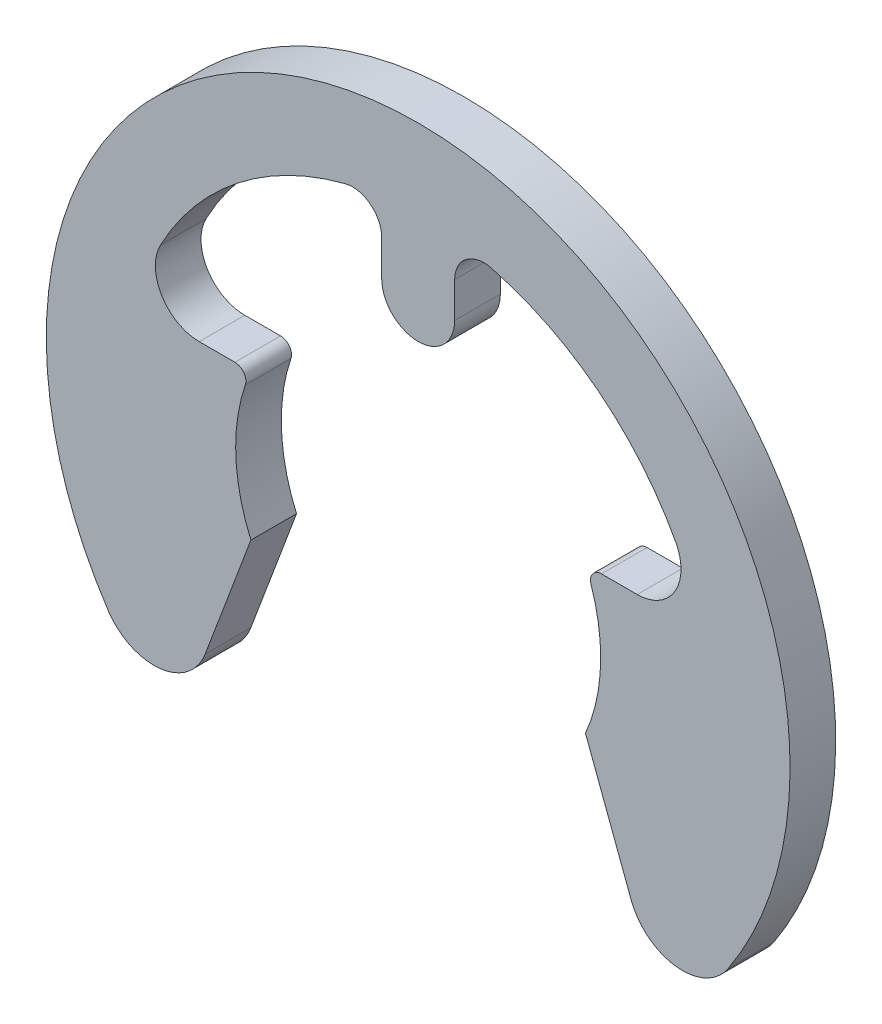
ISO-10303-21;
HEADER;
FILE_DESCRIPTION(('STEP AP214'),'2;1');
FILE_NAME('part.step','',(''),(''),'','','');
FILE_SCHEMA(('AUTOMOTIVE_DESIGN { 1 0 10303 214 1 1 1 1 }'));
ENDSEC;
DATA;
#1=APPLICATION_CONTEXT('core data for automotive mechanical design processes');
#2=APPLICATION_PROTOCOL_DEFINITION('international standard','automotive_design',2000,#1);
#3=PRODUCT_CONTEXT('',#1,'mechanical');
#4=PRODUCT('Part','Part','',(#3));
#5=PRODUCT_RELATED_PRODUCT_CATEGORY('part','',(#4));
#6=PRODUCT_DEFINITION_FORMATION('','',#4);
#7=PRODUCT_DEFINITION_CONTEXT('part definition',#1,'design');
#8=PRODUCT_DEFINITION('design','',#6,#7);
#9=PRODUCT_DEFINITION_SHAPE('','',#8);
#10=(LENGTH_UNIT() NAMED_UNIT(*) SI_UNIT(.MILLI.,.METRE.));
#11=(NAMED_UNIT(*) PLANE_ANGLE_UNIT() SI_UNIT($,.RADIAN.));
#12=(NAMED_UNIT(*) SI_UNIT($,.STERADIAN.) SOLID_ANGLE_UNIT());
#13=UNCERTAINTY_MEASURE_WITH_UNIT(LENGTH_MEASURE(1.E-05),#10,'distance_accuracy_value','');
#14=(GEOMETRIC_REPRESENTATION_CONTEXT(3) GLOBAL_UNCERTAINTY_ASSIGNED_CONTEXT((#13)) GLOBAL_UNIT_ASSIGNED_CONTEXT((#10,
#11,#12)) REPRESENTATION_CONTEXT('',''));
#15=CARTESIAN_POINT('',(0.,0.,0.));
#16=DIRECTION('',(0.,0.,1.));
#17=DIRECTION('',(1.,0.,0.));
#18=AXIS2_PLACEMENT_3D('',#15,#16,#17);
#19=CARTESIAN_POINT('',(0.,-2.35501053749592,0.));
#20=DIRECTION('',(0.,0.,1.));
#21=DIRECTION('',(1.,0.,0.));
#22=AXIS2_PLACEMENT_3D('',#19,#20,#21);
#23=PLANE('',#22);
#24=CARTESIAN_POINT('',(5.79124126513042,-8.31875027863897,0.));
#25=DIRECTION('',(0.,0.,1.));
#26=DIRECTION('',(1.,0.,0.));
#27=AXIS2_PLACEMENT_3D('',#24,#25,#26);
#28=CIRCLE('',#27,1.2);
#29=CARTESIAN_POINT('',(4.66801826128774,-8.74108910427382,0.));
#30=VERTEX_POINT('',#29);
#31=CARTESIAN_POINT('',(6.79116781450546,-8.98218595438676,0.));
#32=VERTEX_POINT('',#31);
#33=EDGE_CURVE('E155',#30,#32,#28,.T.);
#34=ORIENTED_EDGE('',*,*,#33,.F.);
#35=DIRECTION('',(0.351949021362376,-0.936019169868901,0.));
#36=VECTOR('',#35,1.);
#37=CARTESIAN_POINT('',(4.66801826128775,-8.74108910427382,0.));
#38=LINE('',#37,#36);
#39=CARTESIAN_POINT('',(3.66606055596467,-6.076351989933,0.));
#40=VERTEX_POINT('',#39);
#41=EDGE_CURVE('E170',#40,#30,#38,.T.);
#42=ORIENTED_EDGE('',*,*,#41,.F.);
#43=CARTESIAN_POINT('',(0.,-4.476351989933,0.));
#44=DIRECTION('',(0.,0.,1.));
#45=DIRECTION('',(1.,0.,0.));
#46=AXIS2_PLACEMENT_3D('',#43,#44,#45);
#47=CIRCLE('',#46,4.);
#48=CARTESIAN_POINT('',(3.78864917675808,-3.19333312200847,0.));
#49=VERTEX_POINT('',#48);
#50=EDGE_CURVE('E175',#40,#49,#47,.T.);
#51=ORIENTED_EDGE('',*,*,#50,.T.);
#52=CARTESIAN_POINT('',(4.01596812736356,-3.116351989933,0.));
#53=DIRECTION('',(0.,0.,1.));
#54=DIRECTION('',(1.,0.,0.));
#55=AXIS2_PLACEMENT_3D('',#52,#53,#54);
#56=CIRCLE('',#55,0.24);
#57=CARTESIAN_POINT('',(4.01596812736356,-2.876351989933,0.));
#58=VERTEX_POINT('',#57);
#59=EDGE_CURVE('E178',#58,#49,#56,.T.);
#60=ORIENTED_EDGE('',*,*,#59,.F.);
#61=DIRECTION('',(1.,0.,0.));
#62=VECTOR('',#61,1.);
#63=CARTESIAN_POINT('',(4.01596812736356,-2.876351989933,0.));
#64=LINE('',#63,#62);
#65=CARTESIAN_POINT('',(4.8,-2.876351989933,0.));
#66=VERTEX_POINT('',#65);
#67=EDGE_CURVE('E223',#66,#58,#64,.F.);
#68=ORIENTED_EDGE('',*,*,#67,.F.);
#69=CARTESIAN_POINT('',(4.8,-1.916351989933,0.));
#70=DIRECTION('',(0.,0.,1.));
#71=DIRECTION('',(1.,0.,0.));
#72=AXIS2_PLACEMENT_3D('',#69,#70,#71);
#73=CIRCLE('',#72,0.96);
#74=CARTESIAN_POINT('',(5.64705882352941,-1.46458728405065,0.));
#75=VERTEX_POINT('',#74);
#76=EDGE_CURVE('E182',#66,#75,#73,.T.);
#77=ORIENTED_EDGE('',*,*,#76,.T.);
#78=CARTESIAN_POINT('',(0.,-4.476351989933,0.));
#79=DIRECTION('',(0.,0.,1.));
#80=DIRECTION('',(1.,0.,0.));
#81=AXIS2_PLACEMENT_3D('',#78,#79,#80);
#82=CIRCLE('',#81,6.4);
#83=CARTESIAN_POINT('',(1.6,1.72042136399887,0.));
#84=VERTEX_POINT('',#83);
#85=EDGE_CURVE('E186',#75,#84,#82,.T.);
#86=ORIENTED_EDGE('',*,*,#85,.T.);
#87=CARTESIAN_POINT('',(1.44,1.10074402860568,0.));
#88=DIRECTION('',(0.,0.,1.));
#89=DIRECTION('',(1.,0.,0.));
#90=AXIS2_PLACEMENT_3D('',#87,#88,#89);
#91=CIRCLE('',#90,0.64);
#92=CARTESIAN_POINT('',(0.8,1.10074402860568,0.));
#93=VERTEX_POINT('',#92);
#94=EDGE_CURVE('E189',#84,#93,#91,.T.);
#95=ORIENTED_EDGE('',*,*,#94,.T.);
#96=DIRECTION('',(0.,1.,0.));
#97=VECTOR('',#96,1.);
#98=CARTESIAN_POINT('',(0.8,1.10074402860568,0.));
#99=LINE('',#98,#97);
#100=CARTESIAN_POINT('',(0.8,0.323648010067,0.));
#101=VERTEX_POINT('',#100);
#102=EDGE_CURVE('E191',#101,#93,#99,.T.);
#103=ORIENTED_EDGE('',*,*,#102,.F.);
#104=CARTESIAN_POINT('',(0.,0.323648010067,0.));
#105=DIRECTION('',(0.,0.,1.));
#106=DIRECTION('',(1.,0.,0.));
#107=AXIS2_PLACEMENT_3D('',#104,#105,#106);
#108=CIRCLE('',#107,0.8);
#109=CARTESIAN_POINT('',(-0.8,0.323648010067,0.));
#110=VERTEX_POINT('',#109);
#111=EDGE_CURVE('E192',#110,#101,#108,.T.);
#112=ORIENTED_EDGE('',*,*,#111,.F.);
#113=DIRECTION('',(0.,1.,0.));
#114=VECTOR('',#113,1.);
#115=CARTESIAN_POINT('',(-0.8,0.323648010066999,0.));
#116=LINE('',#115,#114);
#117=CARTESIAN_POINT('',(-0.8,1.10074402860568,0.));
#118=VERTEX_POINT('',#117);
#119=EDGE_CURVE('E228',#118,#110,#116,.F.);
#120=ORIENTED_EDGE('',*,*,#119,.F.);
#121=CARTESIAN_POINT('',(-1.44,1.10074402860568,0.));
#122=DIRECTION('',(0.,0.,1.));
#123=DIRECTION('',(1.,0.,0.));
#124=AXIS2_PLACEMENT_3D('',#121,#122,#123);
#125=CIRCLE('',#124,0.64);
#126=CARTESIAN_POINT('',(-1.6,1.72042136399887,0.));
#127=VERTEX_POINT('',#126);
#128=EDGE_CURVE('E196',#118,#127,#125,.T.);
#129=ORIENTED_EDGE('',*,*,#128,.T.);
#130=CARTESIAN_POINT('',(0.,-4.476351989933,0.));
#131=DIRECTION('',(0.,0.,1.));
#132=DIRECTION('',(1.,0.,0.));
#133=AXIS2_PLACEMENT_3D('',#130,#131,#132);
#134=CIRCLE('',#133,6.4);
#135=CARTESIAN_POINT('',(-5.64705882352941,-1.46458728405065,0.));
#136=VERTEX_POINT('',#135);
#137=EDGE_CURVE('E200',#127,#136,#134,.T.);
#138=ORIENTED_EDGE('',*,*,#137,.T.);
#139=CARTESIAN_POINT('',(-4.8,-1.916351989933,0.));
#140=DIRECTION('',(0.,0.,1.));
#141=DIRECTION('',(1.,0.,0.));
#142=AXIS2_PLACEMENT_3D('',#139,#140,#141);
#143=CIRCLE('',#142,0.96);
#144=CARTESIAN_POINT('',(-4.8,-2.876351989933,0.));
#145=VERTEX_POINT('',#144);
#146=EDGE_CURVE('E203',#136,#145,#143,.T.);
#147=ORIENTED_EDGE('',*,*,#146,.T.);
#148=DIRECTION('',(1.,0.,0.));
#149=VECTOR('',#148,1.);
#150=CARTESIAN_POINT('',(-4.8,-2.876351989933,0.));
#151=LINE('',#150,#149);
#152=CARTESIAN_POINT('',(-4.01596812736356,-2.876351989933,0.));
#153=VERTEX_POINT('',#152);
#154=EDGE_CURVE('E205',#153,#145,#151,.F.);
#155=ORIENTED_EDGE('',*,*,#154,.F.);
#156=CARTESIAN_POINT('',(-4.01596812736356,-3.116351989933,0.));
#157=DIRECTION('',(0.,0.,1.));
#158=DIRECTION('',(1.,0.,0.));
#159=AXIS2_PLACEMENT_3D('',#156,#157,#158);
#160=CIRCLE('',#159,0.24);
#161=CARTESIAN_POINT('',(-3.78864917675808,-3.19333312200847,0.));
#162=VERTEX_POINT('',#161);
#163=EDGE_CURVE('E206',#162,#153,#160,.T.);
#164=ORIENTED_EDGE('',*,*,#163,.F.);
#165=CARTESIAN_POINT('',(0.,-4.476351989933,0.));
#166=DIRECTION('',(0.,0.,1.));
#167=DIRECTION('',(1.,0.,0.));
#168=AXIS2_PLACEMENT_3D('',#165,#166,#167);
#169=CIRCLE('',#168,4.);
#170=CARTESIAN_POINT('',(-3.66606055596467,-6.076351989933,0.));
#171=VERTEX_POINT('',#170);
#172=EDGE_CURVE('E210',#162,#171,#169,.T.);
#173=ORIENTED_EDGE('',*,*,#172,.T.);
#174=DIRECTION('',(0.351949021362376,0.936019169868901,0.));
#175=VECTOR('',#174,1.);
#176=CARTESIAN_POINT('',(-3.66606055596467,-6.076351989933,0.));
#177=LINE('',#176,#175);
#178=CARTESIAN_POINT('',(-4.66801826128775,-8.74108910427382,0.));
#179=VERTEX_POINT('',#178);
#180=EDGE_CURVE('E212',#179,#171,#177,.T.);
#181=ORIENTED_EDGE('',*,*,#180,.F.);
#182=CARTESIAN_POINT('',(-5.79124126513042,-8.31875027863897,0.));
#183=DIRECTION('',(0.,0.,1.));
#184=DIRECTION('',(1.,0.,0.));
#185=AXIS2_PLACEMENT_3D('',#182,#183,#184);
#186=CIRCLE('',#185,1.2);
#187=CARTESIAN_POINT('',(-6.79116781450546,-8.98218595438676,0.));
#188=VERTEX_POINT('',#187);
#189=EDGE_CURVE('E157',#188,#179,#186,.T.);
#190=ORIENTED_EDGE('',*,*,#189,.F.);
#191=CARTESIAN_POINT('',(0.,-4.476351989933,0.));
#192=DIRECTION('',(0.,0.,1.));
#193=DIRECTION('',(1.,0.,0.));
#194=AXIS2_PLACEMENT_3D('',#191,#192,#193);
#195=CIRCLE('',#194,8.15);
#196=EDGE_CURVE('E20',#32,#188,#195,.T.);
#197=ORIENTED_EDGE('',*,*,#196,.F.);
#198=EDGE_LOOP('',(#34,#42,#51,#60,#68,#77,#86,#95,#103,#112,#120,#129,#138,#147,#155,#164,#173,
#181,#190,#197));
#199=FACE_BOUND('',#198,.T.);
#200=ADVANCED_FACE('F17',(#199),#23,.F.);
#201=CARTESIAN_POINT('',(0.,-4.476351989933,0.));
#202=DIRECTION('',(0.,0.,1.));
#203=DIRECTION('',(1.,0.,0.));
#204=AXIS2_PLACEMENT_3D('',#201,#202,#203);
#205=CYLINDRICAL_SURFACE('',#204,8.15);
#206=ORIENTED_EDGE('',*,*,#196,.T.);
#207=DIRECTION('',(0.,0.,1.));
#208=VECTOR('',#207,1.);
#209=CARTESIAN_POINT('',(-6.79116781450546,-8.98218595438676,0.));
#210=LINE('',#209,#208);
#211=CARTESIAN_POINT('',(-6.79116781450546,-8.98218595438676,1.));
#212=VERTEX_POINT('',#211);
#213=EDGE_CURVE('E160',#212,#188,#210,.F.);
#214=ORIENTED_EDGE('',*,*,#213,.F.);
#215=CARTESIAN_POINT('',(0.,-4.476351989933,1.));
#216=DIRECTION('',(0.,0.,1.));
#217=DIRECTION('',(1.,0.,0.));
#218=AXIS2_PLACEMENT_3D('',#215,#216,#217);
#219=CIRCLE('',#218,8.15);
#220=CARTESIAN_POINT('',(6.79116781450546,-8.98218595438676,1.));
#221=VERTEX_POINT('',#220);
#222=EDGE_CURVE('E165',#221,#212,#219,.T.);
#223=ORIENTED_EDGE('',*,*,#222,.F.);
#224=DIRECTION('',(0.,0.,1.));
#225=VECTOR('',#224,1.);
#226=CARTESIAN_POINT('',(6.79116781450546,-8.98218595438676,0.));
#227=LINE('',#226,#225);
#228=EDGE_CURVE('E162',#32,#221,#227,.T.);
#229=ORIENTED_EDGE('',*,*,#228,.F.);
#230=EDGE_LOOP('',(#206,#214,#223,#229));
#231=FACE_BOUND('',#230,.T.);
#232=ADVANCED_FACE('F163',(#231),#205,.T.);
#233=CARTESIAN_POINT('',(-5.79124126513042,-8.31875027863897,0.));
#234=DIRECTION('',(0.,0.,1.));
#235=DIRECTION('',(1.,0.,0.));
#236=AXIS2_PLACEMENT_3D('',#233,#234,#235);
#237=CYLINDRICAL_SURFACE('',#236,1.2);
#238=ORIENTED_EDGE('',*,*,#189,.T.);
#239=DIRECTION('',(0.,0.,1.));
#240=VECTOR('',#239,1.);
#241=CARTESIAN_POINT('',(-4.66801826128775,-8.74108910427382,0.));
#242=LINE('',#241,#240);
#243=CARTESIAN_POINT('',(-4.66801826128775,-8.74108910427382,1.));
#244=VERTEX_POINT('',#243);
#245=EDGE_CURVE('E213',#244,#179,#242,.F.);
#246=ORIENTED_EDGE('',*,*,#245,.F.);
#247=CARTESIAN_POINT('',(-5.79124126513042,-8.31875027863897,1.));
#248=DIRECTION('',(0.,0.,1.));
#249=DIRECTION('',(1.,0.,0.));
#250=AXIS2_PLACEMENT_3D('',#247,#248,#249);
#251=CIRCLE('',#250,1.2);
#252=EDGE_CURVE('E272',#212,#244,#251,.T.);
#253=ORIENTED_EDGE('',*,*,#252,.F.);
#254=ORIENTED_EDGE('',*,*,#213,.T.);
#255=EDGE_LOOP('',(#238,#246,#253,#254));
#256=FACE_BOUND('',#255,.T.);
#257=ADVANCED_FACE('F379',(#256),#237,.T.);
#258=CARTESIAN_POINT('',(-3.66606055596467,-6.076351989933,0.));
#259=DIRECTION('',(0.936019169868901,-0.351949021362376,0.));
#260=DIRECTION('',(0.351949021362376,0.936019169868901,0.));
#261=AXIS2_PLACEMENT_3D('',#258,#259,#260);
#262=PLANE('',#261);
#263=ORIENTED_EDGE('',*,*,#180,.T.);
#264=DIRECTION('',(0.,0.,1.));
#265=VECTOR('',#264,1.);
#266=CARTESIAN_POINT('',(-3.66606055596467,-6.076351989933,0.));
#267=LINE('',#266,#265);
#268=CARTESIAN_POINT('',(-3.66606055596467,-6.076351989933,1.));
#269=VERTEX_POINT('',#268);
#270=EDGE_CURVE('E211',#171,#269,#267,.T.);
#271=ORIENTED_EDGE('',*,*,#270,.T.);
#272=DIRECTION('',(0.351949021362376,0.9360191698689,0.));
#273=VECTOR('',#272,1.);
#274=CARTESIAN_POINT('',(-4.66801826128775,-8.74108910427382,1.));
#275=LINE('',#274,#273);
#276=EDGE_CURVE('E271',#244,#269,#275,.T.);
#277=ORIENTED_EDGE('',*,*,#276,.F.);
#278=ORIENTED_EDGE('',*,*,#245,.T.);
#279=EDGE_LOOP('',(#263,#271,#277,#278));
#280=FACE_BOUND('',#279,.T.);
#281=ADVANCED_FACE('F316',(#280),#262,.T.);
#282=CARTESIAN_POINT('',(0.,-4.476351989933,0.));
#283=DIRECTION('',(0.,0.,1.));
#284=DIRECTION('',(1.,0.,0.));
#285=AXIS2_PLACEMENT_3D('',#282,#283,#284);
#286=CYLINDRICAL_SURFACE('',#285,4.);
#287=ORIENTED_EDGE('',*,*,#270,.F.);
#288=ORIENTED_EDGE('',*,*,#172,.F.);
#289=DIRECTION('',(0.,0.,1.));
#290=VECTOR('',#289,1.);
#291=CARTESIAN_POINT('',(-3.78864917675808,-3.19333312200847,0.));
#292=LINE('',#291,#290);
#293=CARTESIAN_POINT('',(-3.78864917675808,-3.19333312200847,1.));
#294=VERTEX_POINT('',#293);
#295=EDGE_CURVE('E209',#294,#162,#292,.F.);
#296=ORIENTED_EDGE('',*,*,#295,.F.);
#297=CARTESIAN_POINT('',(0.,-4.476351989933,1.));
#298=DIRECTION('',(0.,0.,1.));
#299=DIRECTION('',(1.,0.,0.));
#300=AXIS2_PLACEMENT_3D('',#297,#298,#299);
#301=CIRCLE('',#300,4.);
#302=EDGE_CURVE('E269',#269,#294,#301,.F.);
#303=ORIENTED_EDGE('',*,*,#302,.F.);
#304=EDGE_LOOP('',(#287,#288,#296,#303));
#305=FACE_BOUND('',#304,.T.);
#306=ADVANCED_FACE('F318',(#305),#286,.F.);
#307=CARTESIAN_POINT('',(-4.01596812736356,-3.116351989933,0.));
#308=DIRECTION('',(0.,0.,1.));
#309=DIRECTION('',(1.,0.,0.));
#310=AXIS2_PLACEMENT_3D('',#307,#308,#309);
#311=CYLINDRICAL_SURFACE('',#310,0.24);
#312=ORIENTED_EDGE('',*,*,#163,.T.);
#313=DIRECTION('',(0.,0.,1.));
#314=VECTOR('',#313,1.);
#315=CARTESIAN_POINT('',(-4.01596812736356,-2.876351989933,0.));
#316=LINE('',#315,#314);
#317=CARTESIAN_POINT('',(-4.01596812736356,-2.876351989933,1.));
#318=VERTEX_POINT('',#317);
#319=EDGE_CURVE('E208',#318,#153,#316,.F.);
#320=ORIENTED_EDGE('',*,*,#319,.F.);
#321=CARTESIAN_POINT('',(-4.01596812736356,-3.116351989933,1.));
#322=DIRECTION('',(0.,0.,1.));
#323=DIRECTION('',(1.,0.,0.));
#324=AXIS2_PLACEMENT_3D('',#321,#322,#323);
#325=CIRCLE('',#324,0.24);
#326=EDGE_CURVE('E266',#294,#318,#325,.T.);
#327=ORIENTED_EDGE('',*,*,#326,.F.);
#328=ORIENTED_EDGE('',*,*,#295,.T.);
#329=EDGE_LOOP('',(#312,#320,#327,#328));
#330=FACE_BOUND('',#329,.T.);
#331=ADVANCED_FACE('F322',(#330),#311,.T.);
#332=CARTESIAN_POINT('',(-4.8,-2.876351989933,0.));
#333=DIRECTION('',(0.,1.,0.));
#334=DIRECTION('',(0.,0.,1.));
#335=AXIS2_PLACEMENT_3D('',#332,#333,#334);
#336=PLANE('',#335);
#337=ORIENTED_EDGE('',*,*,#154,.T.);
#338=DIRECTION('',(0.,0.,1.));
#339=VECTOR('',#338,1.);
#340=CARTESIAN_POINT('',(-4.8,-2.876351989933,0.));
#341=LINE('',#340,#339);
#342=CARTESIAN_POINT('',(-4.8,-2.876351989933,1.));
#343=VERTEX_POINT('',#342);
#344=EDGE_CURVE('E202',#145,#343,#341,.T.);
#345=ORIENTED_EDGE('',*,*,#344,.T.);
#346=DIRECTION('',(1.,0.,0.));
#347=VECTOR('',#346,1.);
#348=CARTESIAN_POINT('',(0.,-2.876351989933,1.));
#349=LINE('',#348,#347);
#350=EDGE_CURVE('E265',#318,#343,#349,.F.);
#351=ORIENTED_EDGE('',*,*,#350,.F.);
#352=ORIENTED_EDGE('',*,*,#319,.T.);
#353=EDGE_LOOP('',(#337,#345,#351,#352));
#354=FACE_BOUND('',#353,.T.);
#355=ADVANCED_FACE('F326',(#354),#336,.T.);
#356=CARTESIAN_POINT('',(-4.8,-1.916351989933,0.));
#357=DIRECTION('',(0.,0.,1.));
#358=DIRECTION('',(1.,0.,0.));
#359=AXIS2_PLACEMENT_3D('',#356,#357,#358);
#360=CYLINDRICAL_SURFACE('',#359,0.96);
#361=ORIENTED_EDGE('',*,*,#344,.F.);
#362=ORIENTED_EDGE('',*,*,#146,.F.);
#363=DIRECTION('',(0.,0.,1.));
#364=VECTOR('',#363,1.);
#365=CARTESIAN_POINT('',(-5.64705882352941,-1.46458728405065,0.));
#366=LINE('',#365,#364);
#367=CARTESIAN_POINT('',(-5.64705882352941,-1.46458728405065,1.));
#368=VERTEX_POINT('',#367);
#369=EDGE_CURVE('E199',#136,#368,#366,.T.);
#370=ORIENTED_EDGE('',*,*,#369,.T.);
#371=CARTESIAN_POINT('',(-4.8,-1.916351989933,1.));
#372=DIRECTION('',(0.,0.,1.));
#373=DIRECTION('',(1.,0.,0.));
#374=AXIS2_PLACEMENT_3D('',#371,#372,#373);
#375=CIRCLE('',#374,0.96);
#376=EDGE_CURVE('E262',#343,#368,#375,.F.);
#377=ORIENTED_EDGE('',*,*,#376,.F.);
#378=EDGE_LOOP('',(#361,#362,#370,#377));
#379=FACE_BOUND('',#378,.T.);
#380=ADVANCED_FACE('F331',(#379),#360,.F.);
#381=CARTESIAN_POINT('',(0.,-4.476351989933,0.));
#382=DIRECTION('',(0.,0.,1.));
#383=DIRECTION('',(1.,0.,0.));
#384=AXIS2_PLACEMENT_3D('',#381,#382,#383);
#385=CYLINDRICAL_SURFACE('',#384,6.4);
#386=ORIENTED_EDGE('',*,*,#369,.F.);
#387=ORIENTED_EDGE('',*,*,#137,.F.);
#388=DIRECTION('',(0.,0.,1.));
#389=VECTOR('',#388,1.);
#390=CARTESIAN_POINT('',(-1.6,1.72042136399887,0.));
#391=LINE('',#390,#389);
#392=CARTESIAN_POINT('',(-1.6,1.72042136399887,1.));
#393=VERTEX_POINT('',#392);
#394=EDGE_CURVE('E198',#127,#393,#391,.T.);
#395=ORIENTED_EDGE('',*,*,#394,.T.);
#396=CARTESIAN_POINT('',(0.,-4.476351989933,1.));
#397=DIRECTION('',(0.,0.,1.));
#398=DIRECTION('',(1.,0.,0.));
#399=AXIS2_PLACEMENT_3D('',#396,#397,#398);
#400=CIRCLE('',#399,6.4);
#401=EDGE_CURVE('E259',#368,#393,#400,.F.);
#402=ORIENTED_EDGE('',*,*,#401,.F.);
#403=EDGE_LOOP('',(#386,#387,#395,#402));
#404=FACE_BOUND('',#403,.T.);
#405=ADVANCED_FACE('F336',(#404),#385,.F.);
#406=CARTESIAN_POINT('',(-1.44,1.10074402860568,0.));
#407=DIRECTION('',(0.,0.,1.));
#408=DIRECTION('',(1.,0.,0.));
#409=AXIS2_PLACEMENT_3D('',#406,#407,#408);
#410=CYLINDRICAL_SURFACE('',#409,0.64);
#411=ORIENTED_EDGE('',*,*,#394,.F.);
#412=ORIENTED_EDGE('',*,*,#128,.F.);
#413=DIRECTION('',(0.,0.,1.));
#414=VECTOR('',#413,1.);
#415=CARTESIAN_POINT('',(-0.8,1.10074402860568,0.));
#416=LINE('',#415,#414);
#417=CARTESIAN_POINT('',(-0.8,1.10074402860568,1.));
#418=VERTEX_POINT('',#417);
#419=EDGE_CURVE('E230',#418,#118,#416,.F.);
#420=ORIENTED_EDGE('',*,*,#419,.F.);
#421=CARTESIAN_POINT('',(-1.44,1.10074402860568,1.));
#422=DIRECTION('',(0.,0.,1.));
#423=DIRECTION('',(1.,0.,0.));
#424=AXIS2_PLACEMENT_3D('',#421,#422,#423);
#425=CIRCLE('',#424,0.64);
#426=EDGE_CURVE('E256',#393,#418,#425,.F.);
#427=ORIENTED_EDGE('',*,*,#426,.F.);
#428=EDGE_LOOP('',(#411,#412,#420,#427));
#429=FACE_BOUND('',#428,.T.);
#430=ADVANCED_FACE('F340',(#429),#410,.F.);
#431=CARTESIAN_POINT('',(-0.8,0.323648010066999,0.));
#432=DIRECTION('',(-1.,0.,0.));
#433=DIRECTION('',(0.,0.,1.));
#434=AXIS2_PLACEMENT_3D('',#431,#432,#433);
#435=PLANE('',#434);
#436=ORIENTED_EDGE('',*,*,#119,.T.);
#437=DIRECTION('',(0.,0.,1.));
#438=VECTOR('',#437,1.);
#439=CARTESIAN_POINT('',(-0.8,0.323648010066999,0.));
#440=LINE('',#439,#438);
#441=CARTESIAN_POINT('',(-0.8,0.323648010067,1.));
#442=VERTEX_POINT('',#441);
#443=EDGE_CURVE('E195',#442,#110,#440,.F.);
#444=ORIENTED_EDGE('',*,*,#443,.F.);
#445=DIRECTION('',(0.,1.,0.));
#446=VECTOR('',#445,1.);
#447=CARTESIAN_POINT('',(-0.8,-2.35501053749592,1.));
#448=LINE('',#447,#446);
#449=EDGE_CURVE('E255',#418,#442,#448,.F.);
#450=ORIENTED_EDGE('',*,*,#449,.F.);
#451=ORIENTED_EDGE('',*,*,#419,.T.);
#452=EDGE_LOOP('',(#436,#444,#450,#451));
#453=FACE_BOUND('',#452,.T.);
#454=ADVANCED_FACE('F344',(#453),#435,.T.);
#455=CARTESIAN_POINT('',(0.,0.323648010067,0.));
#456=DIRECTION('',(0.,0.,1.));
#457=DIRECTION('',(1.,0.,0.));
#458=AXIS2_PLACEMENT_3D('',#455,#456,#457);
#459=CYLINDRICAL_SURFACE('',#458,0.8);
#460=ORIENTED_EDGE('',*,*,#111,.T.);
#461=DIRECTION('',(0.,0.,-1.));
#462=VECTOR('',#461,1.);
#463=CARTESIAN_POINT('',(0.8,0.323648010066999,0.));
#464=LINE('',#463,#462);
#465=CARTESIAN_POINT('',(0.8,0.323648010067,1.));
#466=VERTEX_POINT('',#465);
#467=EDGE_CURVE('E194',#466,#101,#464,.T.);
#468=ORIENTED_EDGE('',*,*,#467,.F.);
#469=CARTESIAN_POINT('',(0.,0.323648010067,1.));
#470=DIRECTION('',(0.,0.,1.));
#471=DIRECTION('',(1.,0.,0.));
#472=AXIS2_PLACEMENT_3D('',#469,#470,#471);
#473=CIRCLE('',#472,0.8);
#474=EDGE_CURVE('E252',#442,#466,#473,.T.);
#475=ORIENTED_EDGE('',*,*,#474,.F.);
#476=ORIENTED_EDGE('',*,*,#443,.T.);
#477=EDGE_LOOP('',(#460,#468,#475,#476));
#478=FACE_BOUND('',#477,.T.);
#479=ADVANCED_FACE('F348',(#478),#459,.T.);
#480=CARTESIAN_POINT('',(0.8,1.10074402860568,0.));
#481=DIRECTION('',(1.,0.,0.));
#482=DIRECTION('',(0.,0.,-1.));
#483=AXIS2_PLACEMENT_3D('',#480,#481,#482);
#484=PLANE('',#483);
#485=ORIENTED_EDGE('',*,*,#102,.T.);
#486=DIRECTION('',(0.,0.,1.));
#487=VECTOR('',#486,1.);
#488=CARTESIAN_POINT('',(0.8,1.10074402860568,0.));
#489=LINE('',#488,#487);
#490=CARTESIAN_POINT('',(0.8,1.10074402860568,1.));
#491=VERTEX_POINT('',#490);
#492=EDGE_CURVE('E188',#93,#491,#489,.T.);
#493=ORIENTED_EDGE('',*,*,#492,.T.);
#494=DIRECTION('',(0.,1.,0.));
#495=VECTOR('',#494,1.);
#496=CARTESIAN_POINT('',(0.8,-2.35501053749592,1.));
#497=LINE('',#496,#495);
#498=EDGE_CURVE('E251',#466,#491,#497,.T.);
#499=ORIENTED_EDGE('',*,*,#498,.F.);
#500=ORIENTED_EDGE('',*,*,#467,.T.);
#501=EDGE_LOOP('',(#485,#493,#499,#500));
#502=FACE_BOUND('',#501,.T.);
#503=ADVANCED_FACE('F352',(#502),#484,.T.);
#504=CARTESIAN_POINT('',(1.44,1.10074402860568,0.));
#505=DIRECTION('',(0.,0.,1.));
#506=DIRECTION('',(1.,0.,0.));
#507=AXIS2_PLACEMENT_3D('',#504,#505,#506);
#508=CYLINDRICAL_SURFACE('',#507,0.64);
#509=ORIENTED_EDGE('',*,*,#492,.F.);
#510=ORIENTED_EDGE('',*,*,#94,.F.);
#511=DIRECTION('',(0.,0.,1.));
#512=VECTOR('',#511,1.);
#513=CARTESIAN_POINT('',(1.6,1.72042136399887,0.));
#514=LINE('',#513,#512);
#515=CARTESIAN_POINT('',(1.6,1.72042136399887,1.));
#516=VERTEX_POINT('',#515);
#517=EDGE_CURVE('E185',#84,#516,#514,.T.);
#518=ORIENTED_EDGE('',*,*,#517,.T.);
#519=CARTESIAN_POINT('',(1.44,1.10074402860568,1.));
#520=DIRECTION('',(0.,0.,1.));
#521=DIRECTION('',(1.,0.,0.));
#522=AXIS2_PLACEMENT_3D('',#519,#520,#521);
#523=CIRCLE('',#522,0.64);
#524=EDGE_CURVE('E248',#491,#516,#523,.F.);
#525=ORIENTED_EDGE('',*,*,#524,.F.);
#526=EDGE_LOOP('',(#509,#510,#518,#525));
#527=FACE_BOUND('',#526,.T.);
#528=ADVANCED_FACE('F357',(#527),#508,.F.);
#529=CARTESIAN_POINT('',(0.,-4.476351989933,0.));
#530=DIRECTION('',(0.,0.,1.));
#531=DIRECTION('',(1.,0.,0.));
#532=AXIS2_PLACEMENT_3D('',#529,#530,#531);
#533=CYLINDRICAL_SURFACE('',#532,6.4);
#534=ORIENTED_EDGE('',*,*,#517,.F.);
#535=ORIENTED_EDGE('',*,*,#85,.F.);
#536=DIRECTION('',(0.,0.,1.));
#537=VECTOR('',#536,1.);
#538=CARTESIAN_POINT('',(5.64705882352941,-1.46458728405065,0.));
#539=LINE('',#538,#537);
#540=CARTESIAN_POINT('',(5.64705882352941,-1.46458728405065,1.));
#541=VERTEX_POINT('',#540);
#542=EDGE_CURVE('E184',#75,#541,#539,.T.);
#543=ORIENTED_EDGE('',*,*,#542,.T.);
#544=CARTESIAN_POINT('',(0.,-4.476351989933,1.));
#545=DIRECTION('',(0.,0.,1.));
#546=DIRECTION('',(1.,0.,0.));
#547=AXIS2_PLACEMENT_3D('',#544,#545,#546);
#548=CIRCLE('',#547,6.4);
#549=EDGE_CURVE('E245',#516,#541,#548,.F.);
#550=ORIENTED_EDGE('',*,*,#549,.F.);
#551=EDGE_LOOP('',(#534,#535,#543,#550));
#552=FACE_BOUND('',#551,.T.);
#553=ADVANCED_FACE('F362',(#552),#533,.F.);
#554=CARTESIAN_POINT('',(4.8,-1.916351989933,0.));
#555=DIRECTION('',(0.,0.,1.));
#556=DIRECTION('',(1.,0.,0.));
#557=AXIS2_PLACEMENT_3D('',#554,#555,#556);
#558=CYLINDRICAL_SURFACE('',#557,0.96);
#559=ORIENTED_EDGE('',*,*,#542,.F.);
#560=ORIENTED_EDGE('',*,*,#76,.F.);
#561=DIRECTION('',(0.,0.,1.));
#562=VECTOR('',#561,1.);
#563=CARTESIAN_POINT('',(4.8,-2.876351989933,0.));
#564=LINE('',#563,#562);
#565=CARTESIAN_POINT('',(4.8,-2.876351989933,1.));
#566=VERTEX_POINT('',#565);
#567=EDGE_CURVE('E225',#566,#66,#564,.F.);
#568=ORIENTED_EDGE('',*,*,#567,.F.);
#569=CARTESIAN_POINT('',(4.8,-1.916351989933,1.));
#570=DIRECTION('',(0.,0.,1.));
#571=DIRECTION('',(1.,0.,0.));
#572=AXIS2_PLACEMENT_3D('',#569,#570,#571);
#573=CIRCLE('',#572,0.96);
#574=EDGE_CURVE('E242',#541,#566,#573,.F.);
#575=ORIENTED_EDGE('',*,*,#574,.F.);
#576=EDGE_LOOP('',(#559,#560,#568,#575));
#577=FACE_BOUND('',#576,.T.);
#578=ADVANCED_FACE('F366',(#577),#558,.F.);
#579=CARTESIAN_POINT('',(4.01596812736356,-2.876351989933,0.));
#580=DIRECTION('',(0.,1.,0.));
#581=DIRECTION('',(0.,0.,1.));
#582=AXIS2_PLACEMENT_3D('',#579,#580,#581);
#583=PLANE('',#582);
#584=ORIENTED_EDGE('',*,*,#67,.T.);
#585=DIRECTION('',(0.,0.,1.));
#586=VECTOR('',#585,1.);
#587=CARTESIAN_POINT('',(4.01596812736356,-2.876351989933,0.));
#588=LINE('',#587,#586);
#589=CARTESIAN_POINT('',(4.01596812736356,-2.876351989933,1.));
#590=VERTEX_POINT('',#589);
#591=EDGE_CURVE('E181',#590,#58,#588,.F.);
#592=ORIENTED_EDGE('',*,*,#591,.F.);
#593=DIRECTION('',(1.,0.,0.));
#594=VECTOR('',#593,1.);
#595=CARTESIAN_POINT('',(0.,-2.876351989933,1.));
#596=LINE('',#595,#594);
#597=EDGE_CURVE('E241',#566,#590,#596,.F.);
#598=ORIENTED_EDGE('',*,*,#597,.F.);
#599=ORIENTED_EDGE('',*,*,#567,.T.);
#600=EDGE_LOOP('',(#584,#592,#598,#599));
#601=FACE_BOUND('',#600,.T.);
#602=ADVANCED_FACE('F370',(#601),#583,.T.);
#603=CARTESIAN_POINT('',(4.01596812736356,-3.116351989933,0.));
#604=DIRECTION('',(0.,0.,1.));
#605=DIRECTION('',(1.,0.,0.));
#606=AXIS2_PLACEMENT_3D('',#603,#604,#605);
#607=CYLINDRICAL_SURFACE('',#606,0.24);
#608=ORIENTED_EDGE('',*,*,#59,.T.);
#609=DIRECTION('',(0.,0.,1.));
#610=VECTOR('',#609,1.);
#611=CARTESIAN_POINT('',(3.78864917675808,-3.19333312200847,0.));
#612=LINE('',#611,#610);
#613=CARTESIAN_POINT('',(3.78864917675808,-3.19333312200847,1.));
#614=VERTEX_POINT('',#613);
#615=EDGE_CURVE('E177',#49,#614,#612,.T.);
#616=ORIENTED_EDGE('',*,*,#615,.T.);
#617=CARTESIAN_POINT('',(4.01596812736356,-3.116351989933,1.));
#618=DIRECTION('',(0.,0.,1.));
#619=DIRECTION('',(1.,0.,0.));
#620=AXIS2_PLACEMENT_3D('',#617,#618,#619);
#621=CIRCLE('',#620,0.24);
#622=EDGE_CURVE('E238',#590,#614,#621,.T.);
#623=ORIENTED_EDGE('',*,*,#622,.F.);
#624=ORIENTED_EDGE('',*,*,#591,.T.);
#625=EDGE_LOOP('',(#608,#616,#623,#624));
#626=FACE_BOUND('',#625,.T.);
#627=ADVANCED_FACE('F373',(#626),#607,.T.);
#628=CARTESIAN_POINT('',(0.,-4.476351989933,0.));
#629=DIRECTION('',(0.,0.,1.));
#630=DIRECTION('',(1.,0.,0.));
#631=AXIS2_PLACEMENT_3D('',#628,#629,#630);
#632=CYLINDRICAL_SURFACE('',#631,4.);
#633=ORIENTED_EDGE('',*,*,#615,.F.);
#634=ORIENTED_EDGE('',*,*,#50,.F.);
#635=DIRECTION('',(0.,0.,1.));
#636=VECTOR('',#635,1.);
#637=CARTESIAN_POINT('',(3.66606055596467,-6.076351989933,0.));
#638=LINE('',#637,#636);
#639=CARTESIAN_POINT('',(3.66606055596467,-6.076351989933,1.));
#640=VERTEX_POINT('',#639);
#641=EDGE_CURVE('E222',#640,#40,#638,.F.);
#642=ORIENTED_EDGE('',*,*,#641,.F.);
#643=CARTESIAN_POINT('',(0.,-4.476351989933,1.));
#644=DIRECTION('',(0.,0.,1.));
#645=DIRECTION('',(1.,0.,0.));
#646=AXIS2_PLACEMENT_3D('',#643,#644,#645);
#647=CIRCLE('',#646,4.);
#648=EDGE_CURVE('E235',#614,#640,#647,.F.);
#649=ORIENTED_EDGE('',*,*,#648,.F.);
#650=EDGE_LOOP('',(#633,#634,#642,#649));
#651=FACE_BOUND('',#650,.T.);
#652=ADVANCED_FACE('F377',(#651),#632,.F.);
#653=CARTESIAN_POINT('',(4.66801826128775,-8.74108910427382,0.));
#654=DIRECTION('',(-0.936019169868901,-0.351949021362376,0.));
#655=DIRECTION('',(0.351949021362376,-0.936019169868901,0.));
#656=AXIS2_PLACEMENT_3D('',#653,#654,#655);
#657=PLANE('',#656);
#658=ORIENTED_EDGE('',*,*,#41,.T.);
#659=DIRECTION('',(0.,0.,1.));
#660=VECTOR('',#659,1.);
#661=CARTESIAN_POINT('',(4.66801826128774,-8.74108910427382,0.));
#662=LINE('',#661,#660);
#663=CARTESIAN_POINT('',(4.66801826128774,-8.74108910427382,1.));
#664=VERTEX_POINT('',#663);
#665=EDGE_CURVE('E35',#664,#30,#662,.F.);
#666=ORIENTED_EDGE('',*,*,#665,.F.);
#667=DIRECTION('',(0.351949021362376,-0.9360191698689,0.));
#668=VECTOR('',#667,1.);
#669=CARTESIAN_POINT('',(3.66606055596467,-6.076351989933,1.));
#670=LINE('',#669,#668);
#671=EDGE_CURVE('E26',#640,#664,#670,.T.);
#672=ORIENTED_EDGE('',*,*,#671,.F.);
#673=ORIENTED_EDGE('',*,*,#641,.T.);
#674=EDGE_LOOP('',(#658,#666,#672,#673));
#675=FACE_BOUND('',#674,.T.);
#676=ADVANCED_FACE('F378',(#675),#657,.T.);
#677=CARTESIAN_POINT('',(5.79124126513042,-8.31875027863897,0.));
#678=DIRECTION('',(0.,0.,1.));
#679=DIRECTION('',(1.,0.,0.));
#680=AXIS2_PLACEMENT_3D('',#677,#678,#679);
#681=CYLINDRICAL_SURFACE('',#680,1.2);
#682=ORIENTED_EDGE('',*,*,#33,.T.);
#683=ORIENTED_EDGE('',*,*,#228,.T.);
#684=CARTESIAN_POINT('',(5.79124126513042,-8.31875027863897,1.));
#685=DIRECTION('',(0.,0.,1.));
#686=DIRECTION('',(1.,0.,0.));
#687=AXIS2_PLACEMENT_3D('',#684,#685,#686);
#688=CIRCLE('',#687,1.2);
#689=EDGE_CURVE('E11',#664,#221,#688,.T.);
#690=ORIENTED_EDGE('',*,*,#689,.F.);
#691=ORIENTED_EDGE('',*,*,#665,.T.);
#692=EDGE_LOOP('',(#682,#683,#690,#691));
#693=FACE_BOUND('',#692,.T.);
#694=ADVANCED_FACE('F168',(#693),#681,.T.);
#695=CARTESIAN_POINT('',(0.,-2.35501053749592,1.));
#696=DIRECTION('',(0.,0.,1.));
#697=DIRECTION('',(1.,0.,0.));
#698=AXIS2_PLACEMENT_3D('',#695,#696,#697);
#699=PLANE('',#698);
#700=ORIENTED_EDGE('',*,*,#671,.T.);
#701=ORIENTED_EDGE('',*,*,#689,.T.);
#702=ORIENTED_EDGE('',*,*,#222,.T.);
#703=ORIENTED_EDGE('',*,*,#252,.T.);
#704=ORIENTED_EDGE('',*,*,#276,.T.);
#705=ORIENTED_EDGE('',*,*,#302,.T.);
#706=ORIENTED_EDGE('',*,*,#326,.T.);
#707=ORIENTED_EDGE('',*,*,#350,.T.);
#708=ORIENTED_EDGE('',*,*,#376,.T.);
#709=ORIENTED_EDGE('',*,*,#401,.T.);
#710=ORIENTED_EDGE('',*,*,#426,.T.);
#711=ORIENTED_EDGE('',*,*,#449,.T.);
#712=ORIENTED_EDGE('',*,*,#474,.T.);
#713=ORIENTED_EDGE('',*,*,#498,.T.);
#714=ORIENTED_EDGE('',*,*,#524,.T.);
#715=ORIENTED_EDGE('',*,*,#549,.T.);
#716=ORIENTED_EDGE('',*,*,#574,.T.);
#717=ORIENTED_EDGE('',*,*,#597,.T.);
#718=ORIENTED_EDGE('',*,*,#622,.T.);
#719=ORIENTED_EDGE('',*,*,#648,.T.);
#720=EDGE_LOOP('',(#700,#701,#702,#703,#704,#705,#706,#707,#708,#709,#710,#711,#712,#713,#714,
#715,#716,#717,#718,#719));
#721=FACE_BOUND('',#720,.T.);
#722=ADVANCED_FACE('F278',(#721),#699,.T.);
#723=CLOSED_SHELL('',(#200,#232,#257,#281,#306,#331,#355,#380,#405,#430,#454,#479,#503,#528,
#553,#578,#602,#627,#652,#676,#694,#722));
#724=MANIFOLD_SOLID_BREP('B1',#723);
#725=ADVANCED_BREP_SHAPE_REPRESENTATION('',(#18,#724),#14);
#726=SHAPE_DEFINITION_REPRESENTATION(#9,#725);
ENDSEC;
END-ISO-10303-21;
